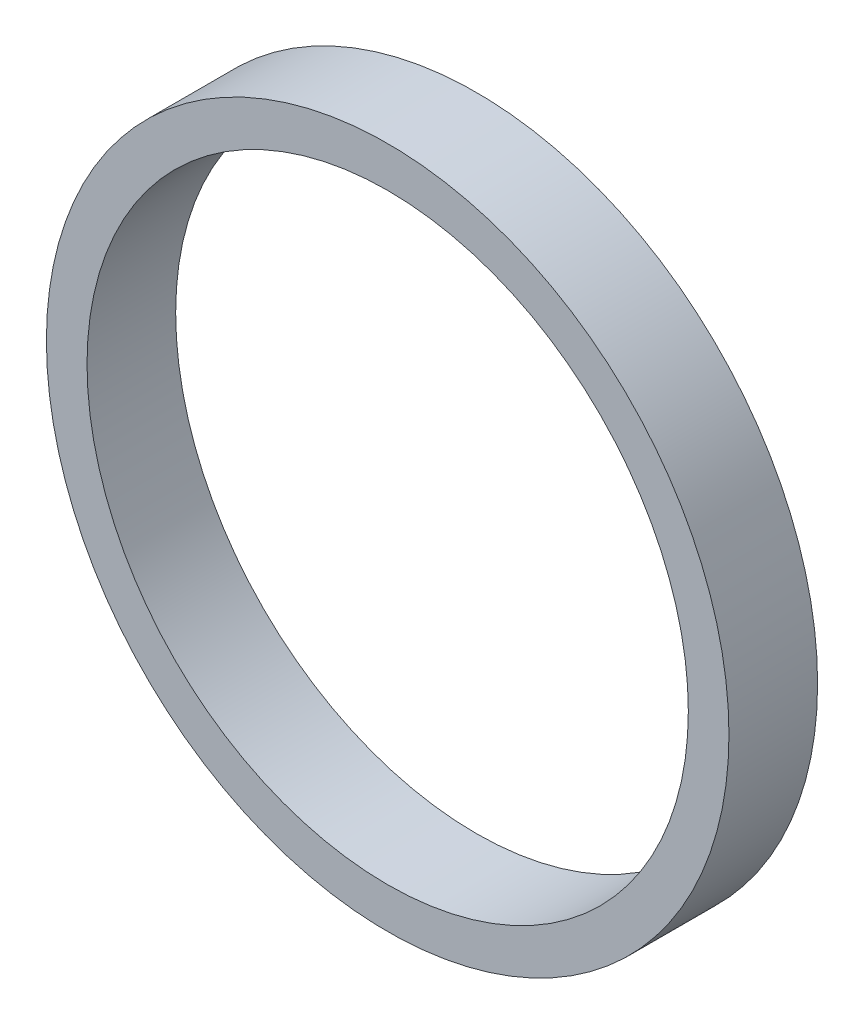
ISO-10303-21;
HEADER;
FILE_DESCRIPTION(('STEP AP214'),'2;1');
FILE_NAME('part.step','',(''),(''),'','','');
FILE_SCHEMA(('AUTOMOTIVE_DESIGN { 1 0 10303 214 1 1 1 1 }'));
ENDSEC;
DATA;
#1=APPLICATION_CONTEXT('core data for automotive mechanical design processes');
#2=APPLICATION_PROTOCOL_DEFINITION('international standard','automotive_design',2000,#1);
#3=PRODUCT_CONTEXT('',#1,'mechanical');
#4=PRODUCT('Part','Part','',(#3));
#5=PRODUCT_RELATED_PRODUCT_CATEGORY('part','',(#4));
#6=PRODUCT_DEFINITION_FORMATION('','',#4);
#7=PRODUCT_DEFINITION_CONTEXT('part definition',#1,'design');
#8=PRODUCT_DEFINITION('design','',#6,#7);
#9=PRODUCT_DEFINITION_SHAPE('','',#8);
#10=(LENGTH_UNIT() NAMED_UNIT(*) SI_UNIT(.MILLI.,.METRE.));
#11=(NAMED_UNIT(*) PLANE_ANGLE_UNIT() SI_UNIT($,.RADIAN.));
#12=(NAMED_UNIT(*) SI_UNIT($,.STERADIAN.) SOLID_ANGLE_UNIT());
#13=UNCERTAINTY_MEASURE_WITH_UNIT(LENGTH_MEASURE(1.E-05),#10,'distance_accuracy_value','');
#14=(GEOMETRIC_REPRESENTATION_CONTEXT(3) GLOBAL_UNCERTAINTY_ASSIGNED_CONTEXT((#13)) GLOBAL_UNIT_ASSIGNED_CONTEXT((#10,
#11,#12)) REPRESENTATION_CONTEXT('',''));
#15=CARTESIAN_POINT('',(0.,0.,0.));
#16=DIRECTION('',(0.,0.,1.));
#17=DIRECTION('',(1.,0.,0.));
#18=AXIS2_PLACEMENT_3D('',#15,#16,#17);
#19=CARTESIAN_POINT('',(0.,0.,1.5));
#20=DIRECTION('',(0.,0.,1.));
#21=DIRECTION('',(1.,0.,0.));
#22=AXIS2_PLACEMENT_3D('',#19,#20,#21);
#23=PLANE('',#22);
#24=CARTESIAN_POINT('',(0.,0.,1.5));
#25=DIRECTION('',(0.,0.,1.));
#26=DIRECTION('',(1.,0.,0.));
#27=AXIS2_PLACEMENT_3D('',#24,#25,#26);
#28=CIRCLE('',#27,5.775);
#29=CARTESIAN_POINT('',(5.775,0.,1.5));
#30=VERTEX_POINT('',#29);
#31=EDGE_CURVE('E10',#30,#30,#28,.T.);
#32=ORIENTED_EDGE('',*,*,#31,.T.);
#33=EDGE_LOOP('',(#32));
#34=FACE_BOUND('',#33,.T.);
#35=CARTESIAN_POINT('',(0.,0.,1.5));
#36=DIRECTION('',(0.,0.,1.));
#37=DIRECTION('',(1.,0.,0.));
#38=AXIS2_PLACEMENT_3D('',#35,#36,#37);
#39=CIRCLE('',#38,5.0875);
#40=CARTESIAN_POINT('',(5.0875,0.,1.5));
#41=VERTEX_POINT('',#40);
#42=EDGE_CURVE('E48',#41,#41,#39,.T.);
#43=ORIENTED_EDGE('',*,*,#42,.F.);
#44=EDGE_LOOP('',(#43));
#45=FACE_BOUND('',#44,.T.);
#46=ADVANCED_FACE('F37',(#34,#45),#23,.T.);
#47=CARTESIAN_POINT('',(0.,0.,0.));
#48=DIRECTION('',(0.,0.,1.));
#49=DIRECTION('',(1.,0.,0.));
#50=AXIS2_PLACEMENT_3D('',#47,#48,#49);
#51=PLANE('',#50);
#52=CARTESIAN_POINT('',(0.,0.,0.));
#53=DIRECTION('',(0.,0.,1.));
#54=DIRECTION('',(1.,0.,0.));
#55=AXIS2_PLACEMENT_3D('',#52,#53,#54);
#56=CIRCLE('',#55,5.775);
#57=CARTESIAN_POINT('',(5.775,0.,0.));
#58=VERTEX_POINT('',#57);
#59=EDGE_CURVE('E41',#58,#58,#56,.T.);
#60=ORIENTED_EDGE('',*,*,#59,.F.);
#61=EDGE_LOOP('',(#60));
#62=FACE_BOUND('',#61,.T.);
#63=CARTESIAN_POINT('',(0.,0.,0.));
#64=DIRECTION('',(0.,0.,1.));
#65=DIRECTION('',(1.,0.,0.));
#66=AXIS2_PLACEMENT_3D('',#63,#64,#65);
#67=CIRCLE('',#66,5.0875);
#68=CARTESIAN_POINT('',(5.0875,0.,0.));
#69=VERTEX_POINT('',#68);
#70=EDGE_CURVE('E50',#69,#69,#67,.T.);
#71=ORIENTED_EDGE('',*,*,#70,.T.);
#72=EDGE_LOOP('',(#71));
#73=FACE_BOUND('',#72,.T.);
#74=ADVANCED_FACE('F60',(#62,#73),#51,.F.);
#75=CARTESIAN_POINT('',(0.,0.,1.5));
#76=DIRECTION('',(0.,0.,-1.));
#77=DIRECTION('',(-1.,0.,0.));
#78=AXIS2_PLACEMENT_3D('',#75,#76,#77);
#79=CYLINDRICAL_SURFACE('',#78,5.775);
#80=ORIENTED_EDGE('',*,*,#31,.F.);
#81=EDGE_LOOP('',(#80));
#82=FACE_BOUND('',#81,.T.);
#83=ORIENTED_EDGE('',*,*,#59,.T.);
#84=EDGE_LOOP('',(#83));
#85=FACE_BOUND('',#84,.T.);
#86=ADVANCED_FACE('F39',(#82,#85),#79,.T.);
#87=CARTESIAN_POINT('',(0.,0.,1.5));
#88=DIRECTION('',(0.,0.,-1.));
#89=DIRECTION('',(-1.,0.,0.));
#90=AXIS2_PLACEMENT_3D('',#87,#88,#89);
#91=CYLINDRICAL_SURFACE('',#90,5.0875);
#92=ORIENTED_EDGE('',*,*,#42,.T.);
#93=EDGE_LOOP('',(#92));
#94=FACE_BOUND('',#93,.T.);
#95=ORIENTED_EDGE('',*,*,#70,.F.);
#96=EDGE_LOOP('',(#95));
#97=FACE_BOUND('',#96,.T.);
#98=ADVANCED_FACE('F56',(#94,#97),#91,.F.);
#99=CLOSED_SHELL('',(#46,#74,#86,#98));
#100=MANIFOLD_SOLID_BREP('B2',#99);
#101=ADVANCED_BREP_SHAPE_REPRESENTATION('',(#18,#100),#14);
#102=SHAPE_DEFINITION_REPRESENTATION(#9,#101);
ENDSEC;
END-ISO-10303-21;
